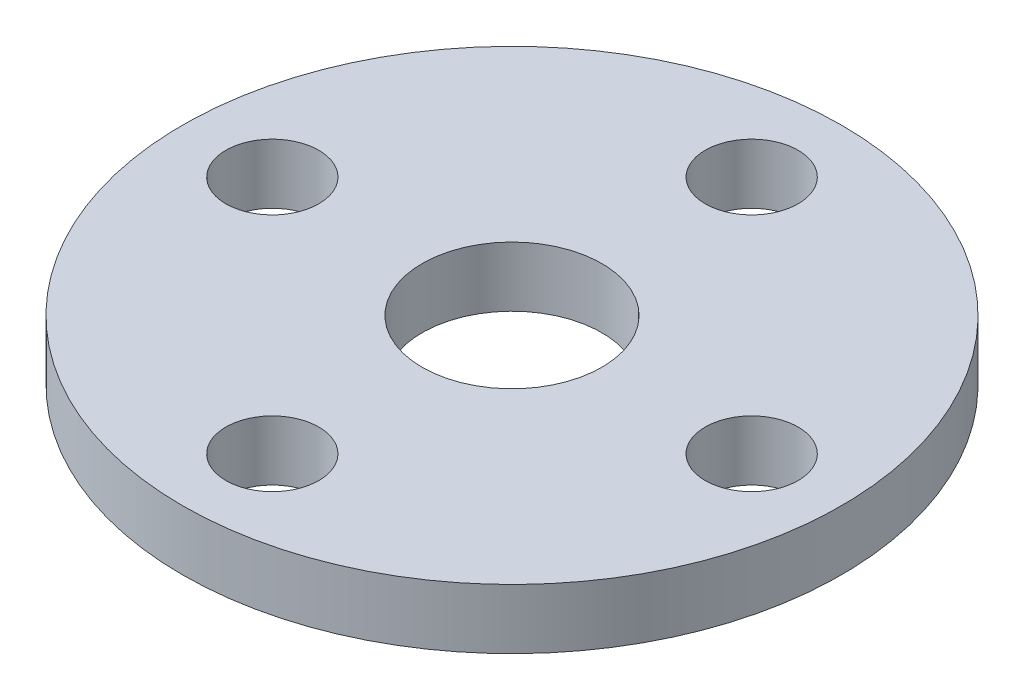
ISO-10303-21;
HEADER;
FILE_DESCRIPTION(('STEP AP214'),'2;1');
FILE_NAME('part.step','',(''),(''),'','','');
FILE_SCHEMA(('AUTOMOTIVE_DESIGN { 1 0 10303 214 1 1 1 1 }'));
ENDSEC;
DATA;
#1=APPLICATION_CONTEXT('core data for automotive mechanical design processes');
#2=APPLICATION_PROTOCOL_DEFINITION('international standard','automotive_design',2000,#1);
#3=PRODUCT_CONTEXT('',#1,'mechanical');
#4=PRODUCT('Part','Part','',(#3));
#5=PRODUCT_RELATED_PRODUCT_CATEGORY('part','',(#4));
#6=PRODUCT_DEFINITION_FORMATION('','',#4);
#7=PRODUCT_DEFINITION_CONTEXT('part definition',#1,'design');
#8=PRODUCT_DEFINITION('design','',#6,#7);
#9=PRODUCT_DEFINITION_SHAPE('','',#8);
#10=(LENGTH_UNIT() NAMED_UNIT(*) SI_UNIT(.MILLI.,.METRE.));
#11=(NAMED_UNIT(*) PLANE_ANGLE_UNIT() SI_UNIT($,.RADIAN.));
#12=(NAMED_UNIT(*) SI_UNIT($,.STERADIAN.) SOLID_ANGLE_UNIT());
#13=UNCERTAINTY_MEASURE_WITH_UNIT(LENGTH_MEASURE(1.E-05),#10,'distance_accuracy_value','');
#14=(GEOMETRIC_REPRESENTATION_CONTEXT(3) GLOBAL_UNCERTAINTY_ASSIGNED_CONTEXT((#13)) GLOBAL_UNIT_ASSIGNED_CONTEXT((#10,
#11,#12)) REPRESENTATION_CONTEXT('',''));
#15=CARTESIAN_POINT('',(0.,0.,0.));
#16=DIRECTION('',(0.,0.,1.));
#17=DIRECTION('',(1.,0.,0.));
#18=AXIS2_PLACEMENT_3D('',#15,#16,#17);
#19=CARTESIAN_POINT('',(0.,2.,0.));
#20=DIRECTION('',(0.,1.,0.));
#21=DIRECTION('',(0.,0.,1.));
#22=AXIS2_PLACEMENT_3D('',#19,#20,#21);
#23=PLANE('',#22);
#24=CARTESIAN_POINT('',(0.,2.,8.));
#25=DIRECTION('',(0.,1.,0.));
#26=DIRECTION('',(0.,0.,1.));
#27=AXIS2_PLACEMENT_3D('',#24,#25,#26);
#28=CIRCLE('',#27,1.55);
#29=CARTESIAN_POINT('',(0.,2.,9.55));
#30=VERTEX_POINT('',#29);
#31=EDGE_CURVE('E59',#30,#30,#28,.T.);
#32=ORIENTED_EDGE('',*,*,#31,.F.);
#33=EDGE_LOOP('',(#32));
#34=FACE_BOUND('',#33,.T.);
#35=CARTESIAN_POINT('',(0.,2.,0.));
#36=DIRECTION('',(0.,1.,0.));
#37=DIRECTION('',(0.,0.,1.));
#38=AXIS2_PLACEMENT_3D('',#35,#36,#37);
#39=CIRCLE('',#38,3.);
#40=CARTESIAN_POINT('',(0.,2.,3.));
#41=VERTEX_POINT('',#40);
#42=EDGE_CURVE('E47',#41,#41,#39,.T.);
#43=ORIENTED_EDGE('',*,*,#42,.F.);
#44=EDGE_LOOP('',(#43));
#45=FACE_BOUND('',#44,.T.);
#46=CARTESIAN_POINT('',(0.,2.,0.));
#47=DIRECTION('',(0.,1.,0.));
#48=DIRECTION('',(0.,0.,1.));
#49=AXIS2_PLACEMENT_3D('',#46,#47,#48);
#50=CIRCLE('',#49,11.);
#51=CARTESIAN_POINT('',(0.,2.,11.));
#52=VERTEX_POINT('',#51);
#53=EDGE_CURVE('E10',#52,#52,#50,.T.);
#54=ORIENTED_EDGE('',*,*,#53,.T.);
#55=EDGE_LOOP('',(#54));
#56=FACE_BOUND('',#55,.T.);
#57=CARTESIAN_POINT('',(0.,2.,-8.));
#58=DIRECTION('',(0.,1.,0.));
#59=DIRECTION('',(0.,0.,1.));
#60=AXIS2_PLACEMENT_3D('',#57,#58,#59);
#61=CIRCLE('',#60,1.55);
#62=CARTESIAN_POINT('',(0.,2.,-6.45));
#63=VERTEX_POINT('',#62);
#64=EDGE_CURVE('E42',#63,#63,#61,.T.);
#65=ORIENTED_EDGE('',*,*,#64,.F.);
#66=EDGE_LOOP('',(#65));
#67=FACE_BOUND('',#66,.T.);
#68=CARTESIAN_POINT('',(8.,2.,0.));
#69=DIRECTION('',(0.,1.,0.));
#70=DIRECTION('',(0.,0.,1.));
#71=AXIS2_PLACEMENT_3D('',#68,#69,#70);
#72=CIRCLE('',#71,1.55);
#73=CARTESIAN_POINT('',(8.,2.,1.55000000000003));
#74=VERTEX_POINT('',#73);
#75=EDGE_CURVE('E53',#74,#74,#72,.T.);
#76=ORIENTED_EDGE('',*,*,#75,.F.);
#77=EDGE_LOOP('',(#76));
#78=FACE_BOUND('',#77,.T.);
#79=CARTESIAN_POINT('',(-8.,2.,0.));
#80=DIRECTION('',(0.,1.,0.));
#81=DIRECTION('',(0.,0.,1.));
#82=AXIS2_PLACEMENT_3D('',#79,#80,#81);
#83=CIRCLE('',#82,1.55);
#84=CARTESIAN_POINT('',(-8.,2.,1.54999999999992));
#85=VERTEX_POINT('',#84);
#86=EDGE_CURVE('E65',#85,#85,#83,.T.);
#87=ORIENTED_EDGE('',*,*,#86,.F.);
#88=EDGE_LOOP('',(#87));
#89=FACE_BOUND('',#88,.T.);
#90=ADVANCED_FACE('F31',(#34,#45,#56,#67,#78,#89),#23,.T.);
#91=CARTESIAN_POINT('',(0.,0.,0.));
#92=DIRECTION('',(0.,1.,0.));
#93=DIRECTION('',(0.,0.,1.));
#94=AXIS2_PLACEMENT_3D('',#91,#92,#93);
#95=PLANE('',#94);
#96=CARTESIAN_POINT('',(0.,0.,0.));
#97=DIRECTION('',(0.,1.,0.));
#98=DIRECTION('',(0.,0.,1.));
#99=AXIS2_PLACEMENT_3D('',#96,#97,#98);
#100=CIRCLE('',#99,11.);
#101=CARTESIAN_POINT('',(0.,0.,11.));
#102=VERTEX_POINT('',#101);
#103=EDGE_CURVE('E35',#102,#102,#100,.T.);
#104=ORIENTED_EDGE('',*,*,#103,.F.);
#105=EDGE_LOOP('',(#104));
#106=FACE_BOUND('',#105,.T.);
#107=CARTESIAN_POINT('',(0.,0.,-8.));
#108=DIRECTION('',(0.,1.,0.));
#109=DIRECTION('',(0.,0.,1.));
#110=AXIS2_PLACEMENT_3D('',#107,#108,#109);
#111=CIRCLE('',#110,1.55);
#112=CARTESIAN_POINT('',(0.,0.,-6.45));
#113=VERTEX_POINT('',#112);
#114=EDGE_CURVE('E44',#113,#113,#111,.T.);
#115=ORIENTED_EDGE('',*,*,#114,.T.);
#116=EDGE_LOOP('',(#115));
#117=FACE_BOUND('',#116,.T.);
#118=CARTESIAN_POINT('',(0.,0.,0.));
#119=DIRECTION('',(0.,1.,0.));
#120=DIRECTION('',(0.,0.,1.));
#121=AXIS2_PLACEMENT_3D('',#118,#119,#120);
#122=CIRCLE('',#121,3.);
#123=CARTESIAN_POINT('',(0.,0.,3.));
#124=VERTEX_POINT('',#123);
#125=EDGE_CURVE('E50',#124,#124,#122,.T.);
#126=ORIENTED_EDGE('',*,*,#125,.T.);
#127=EDGE_LOOP('',(#126));
#128=FACE_BOUND('',#127,.T.);
#129=CARTESIAN_POINT('',(8.,0.,0.));
#130=DIRECTION('',(0.,1.,0.));
#131=DIRECTION('',(0.,0.,1.));
#132=AXIS2_PLACEMENT_3D('',#129,#130,#131);
#133=CIRCLE('',#132,1.55);
#134=CARTESIAN_POINT('',(8.,0.,1.55000000000003));
#135=VERTEX_POINT('',#134);
#136=EDGE_CURVE('E56',#135,#135,#133,.T.);
#137=ORIENTED_EDGE('',*,*,#136,.T.);
#138=EDGE_LOOP('',(#137));
#139=FACE_BOUND('',#138,.T.);
#140=CARTESIAN_POINT('',(0.,0.,8.));
#141=DIRECTION('',(0.,1.,0.));
#142=DIRECTION('',(0.,0.,1.));
#143=AXIS2_PLACEMENT_3D('',#140,#141,#142);
#144=CIRCLE('',#143,1.55);
#145=CARTESIAN_POINT('',(0.,0.,9.55));
#146=VERTEX_POINT('',#145);
#147=EDGE_CURVE('E62',#146,#146,#144,.T.);
#148=ORIENTED_EDGE('',*,*,#147,.T.);
#149=EDGE_LOOP('',(#148));
#150=FACE_BOUND('',#149,.T.);
#151=CARTESIAN_POINT('',(-8.,0.,0.));
#152=DIRECTION('',(0.,1.,0.));
#153=DIRECTION('',(0.,0.,1.));
#154=AXIS2_PLACEMENT_3D('',#151,#152,#153);
#155=CIRCLE('',#154,1.55);
#156=CARTESIAN_POINT('',(-8.,0.,1.54999999999992));
#157=VERTEX_POINT('',#156);
#158=EDGE_CURVE('E68',#157,#157,#155,.T.);
#159=ORIENTED_EDGE('',*,*,#158,.T.);
#160=EDGE_LOOP('',(#159));
#161=FACE_BOUND('',#160,.T.);
#162=ADVANCED_FACE('F78',(#106,#117,#128,#139,#150,#161),#95,.F.);
#163=CARTESIAN_POINT('',(0.,2.,0.));
#164=DIRECTION('',(0.,-1.,0.));
#165=DIRECTION('',(0.,0.,-1.));
#166=AXIS2_PLACEMENT_3D('',#163,#164,#165);
#167=CYLINDRICAL_SURFACE('',#166,11.);
#168=ORIENTED_EDGE('',*,*,#53,.F.);
#169=EDGE_LOOP('',(#168));
#170=FACE_BOUND('',#169,.T.);
#171=ORIENTED_EDGE('',*,*,#103,.T.);
#172=EDGE_LOOP('',(#171));
#173=FACE_BOUND('',#172,.T.);
#174=ADVANCED_FACE('F33',(#170,#173),#167,.T.);
#175=CARTESIAN_POINT('',(0.,2.,-8.));
#176=DIRECTION('',(0.,-1.,0.));
#177=DIRECTION('',(0.,0.,-1.));
#178=AXIS2_PLACEMENT_3D('',#175,#176,#177);
#179=CYLINDRICAL_SURFACE('',#178,1.55);
#180=ORIENTED_EDGE('',*,*,#64,.T.);
#181=EDGE_LOOP('',(#180));
#182=FACE_BOUND('',#181,.T.);
#183=ORIENTED_EDGE('',*,*,#114,.F.);
#184=EDGE_LOOP('',(#183));
#185=FACE_BOUND('',#184,.T.);
#186=ADVANCED_FACE('F88',(#182,#185),#179,.F.);
#187=CARTESIAN_POINT('',(0.,2.,0.));
#188=DIRECTION('',(0.,-1.,0.));
#189=DIRECTION('',(0.,0.,-1.));
#190=AXIS2_PLACEMENT_3D('',#187,#188,#189);
#191=CYLINDRICAL_SURFACE('',#190,3.);
#192=ORIENTED_EDGE('',*,*,#42,.T.);
#193=EDGE_LOOP('',(#192));
#194=FACE_BOUND('',#193,.T.);
#195=ORIENTED_EDGE('',*,*,#125,.F.);
#196=EDGE_LOOP('',(#195));
#197=FACE_BOUND('',#196,.T.);
#198=ADVANCED_FACE('F91',(#194,#197),#191,.F.);
#199=CARTESIAN_POINT('',(8.,2.,0.));
#200=DIRECTION('',(0.,-1.,0.));
#201=DIRECTION('',(0.,0.,-1.));
#202=AXIS2_PLACEMENT_3D('',#199,#200,#201);
#203=CYLINDRICAL_SURFACE('',#202,1.55);
#204=ORIENTED_EDGE('',*,*,#75,.T.);
#205=EDGE_LOOP('',(#204));
#206=FACE_BOUND('',#205,.T.);
#207=ORIENTED_EDGE('',*,*,#136,.F.);
#208=EDGE_LOOP('',(#207));
#209=FACE_BOUND('',#208,.T.);
#210=ADVANCED_FACE('F95',(#206,#209),#203,.F.);
#211=CARTESIAN_POINT('',(0.,2.,8.));
#212=DIRECTION('',(0.,-1.,0.));
#213=DIRECTION('',(0.,0.,-1.));
#214=AXIS2_PLACEMENT_3D('',#211,#212,#213);
#215=CYLINDRICAL_SURFACE('',#214,1.55);
#216=ORIENTED_EDGE('',*,*,#31,.T.);
#217=EDGE_LOOP('',(#216));
#218=FACE_BOUND('',#217,.T.);
#219=ORIENTED_EDGE('',*,*,#147,.F.);
#220=EDGE_LOOP('',(#219));
#221=FACE_BOUND('',#220,.T.);
#222=ADVANCED_FACE('F99',(#218,#221),#215,.F.);
#223=CARTESIAN_POINT('',(-8.,2.,0.));
#224=DIRECTION('',(0.,-1.,0.));
#225=DIRECTION('',(0.,0.,-1.));
#226=AXIS2_PLACEMENT_3D('',#223,#224,#225);
#227=CYLINDRICAL_SURFACE('',#226,1.55);
#228=ORIENTED_EDGE('',*,*,#86,.T.);
#229=EDGE_LOOP('',(#228));
#230=FACE_BOUND('',#229,.T.);
#231=ORIENTED_EDGE('',*,*,#158,.F.);
#232=EDGE_LOOP('',(#231));
#233=FACE_BOUND('',#232,.T.);
#234=ADVANCED_FACE('F74',(#230,#233),#227,.F.);
#235=CLOSED_SHELL('',(#90,#162,#174,#186,#198,#210,#222,#234));
#236=MANIFOLD_SOLID_BREP('B2',#235);
#237=ADVANCED_BREP_SHAPE_REPRESENTATION('',(#18,#236),#14);
#238=SHAPE_DEFINITION_REPRESENTATION(#9,#237);
ENDSEC;
END-ISO-10303-21;
